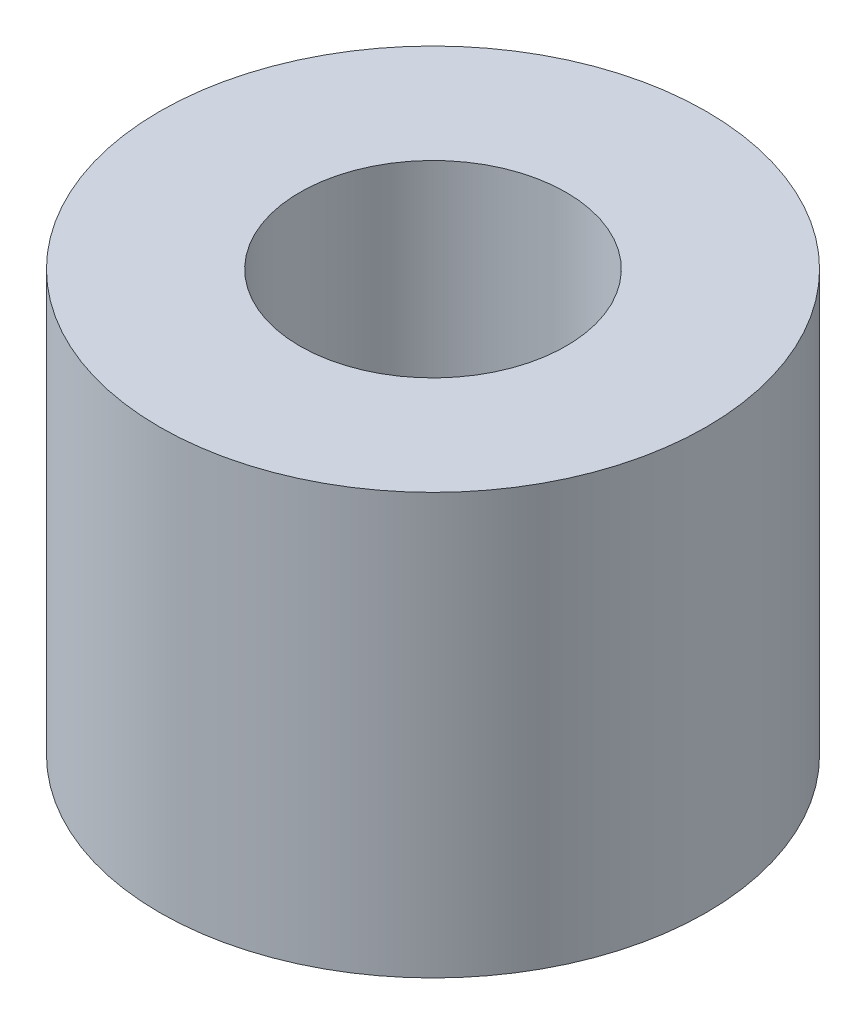
ISO-10303-21;
HEADER;
FILE_DESCRIPTION(('STEP AP214'),'2;1');
FILE_NAME('part.step','',(''),(''),'','','');
FILE_SCHEMA(('AUTOMOTIVE_DESIGN { 1 0 10303 214 1 1 1 1 }'));
ENDSEC;
DATA;
#1=APPLICATION_CONTEXT('core data for automotive mechanical design processes');
#2=APPLICATION_PROTOCOL_DEFINITION('international standard','automotive_design',2000,#1);
#3=PRODUCT_CONTEXT('',#1,'mechanical');
#4=PRODUCT('Part','Part','',(#3));
#5=PRODUCT_RELATED_PRODUCT_CATEGORY('part','',(#4));
#6=PRODUCT_DEFINITION_FORMATION('','',#4);
#7=PRODUCT_DEFINITION_CONTEXT('part definition',#1,'design');
#8=PRODUCT_DEFINITION('design','',#6,#7);
#9=PRODUCT_DEFINITION_SHAPE('','',#8);
#10=(LENGTH_UNIT() NAMED_UNIT(*) SI_UNIT(.MILLI.,.METRE.));
#11=(NAMED_UNIT(*) PLANE_ANGLE_UNIT() SI_UNIT($,.RADIAN.));
#12=(NAMED_UNIT(*) SI_UNIT($,.STERADIAN.) SOLID_ANGLE_UNIT());
#13=UNCERTAINTY_MEASURE_WITH_UNIT(LENGTH_MEASURE(1.E-05),#10,'distance_accuracy_value','');
#14=(GEOMETRIC_REPRESENTATION_CONTEXT(3) GLOBAL_UNCERTAINTY_ASSIGNED_CONTEXT((#13)) GLOBAL_UNIT_ASSIGNED_CONTEXT((#10,
#11,#12)) REPRESENTATION_CONTEXT('',''));
#15=CARTESIAN_POINT('',(0.,0.,0.));
#16=DIRECTION('',(0.,0.,1.));
#17=DIRECTION('',(1.,0.,0.));
#18=AXIS2_PLACEMENT_3D('',#15,#16,#17);
#19=CARTESIAN_POINT('',(0.,3.,0.));
#20=DIRECTION('',(0.,1.,0.));
#21=DIRECTION('',(0.,0.,1.));
#22=AXIS2_PLACEMENT_3D('',#19,#20,#21);
#23=PLANE('',#22);
#24=CARTESIAN_POINT('',(0.,3.,0.));
#25=DIRECTION('',(0.,1.,0.));
#26=DIRECTION('',(0.,0.,1.));
#27=AXIS2_PLACEMENT_3D('',#24,#25,#26);
#28=CIRCLE('',#27,1.95);
#29=CARTESIAN_POINT('',(0.,3.,1.95));
#30=VERTEX_POINT('',#29);
#31=EDGE_CURVE('E10',#30,#30,#28,.T.);
#32=ORIENTED_EDGE('',*,*,#31,.T.);
#33=EDGE_LOOP('',(#32));
#34=FACE_BOUND('',#33,.T.);
#35=CARTESIAN_POINT('',(0.,3.,0.));
#36=DIRECTION('',(0.,1.,0.));
#37=DIRECTION('',(0.,0.,1.));
#38=AXIS2_PLACEMENT_3D('',#35,#36,#37);
#39=CIRCLE('',#38,0.95);
#40=CARTESIAN_POINT('',(0.,3.,0.95));
#41=VERTEX_POINT('',#40);
#42=EDGE_CURVE('E56',#41,#41,#39,.T.);
#43=ORIENTED_EDGE('',*,*,#42,.F.);
#44=EDGE_LOOP('',(#43));
#45=FACE_BOUND('',#44,.T.);
#46=ADVANCED_FACE('F43',(#34,#45),#23,.T.);
#47=CARTESIAN_POINT('',(0.,0.,0.));
#48=DIRECTION('',(0.,1.,0.));
#49=DIRECTION('',(0.,0.,1.));
#50=AXIS2_PLACEMENT_3D('',#47,#48,#49);
#51=PLANE('',#50);
#52=CARTESIAN_POINT('',(0.,0.,0.));
#53=DIRECTION('',(0.,1.,0.));
#54=DIRECTION('',(0.,0.,1.));
#55=AXIS2_PLACEMENT_3D('',#52,#53,#54);
#56=CIRCLE('',#55,1.95);
#57=CARTESIAN_POINT('',(0.,0.,1.95));
#58=VERTEX_POINT('',#57);
#59=EDGE_CURVE('E47',#58,#58,#56,.T.);
#60=ORIENTED_EDGE('',*,*,#59,.F.);
#61=EDGE_LOOP('',(#60));
#62=FACE_BOUND('',#61,.T.);
#63=CARTESIAN_POINT('',(0.,0.,0.));
#64=DIRECTION('',(0.,1.,0.));
#65=DIRECTION('',(0.,0.,1.));
#66=AXIS2_PLACEMENT_3D('',#63,#64,#65);
#67=CIRCLE('',#66,0.95);
#68=CARTESIAN_POINT('',(0.,0.,0.95));
#69=VERTEX_POINT('',#68);
#70=EDGE_CURVE('E58',#69,#69,#67,.T.);
#71=ORIENTED_EDGE('',*,*,#70,.T.);
#72=EDGE_LOOP('',(#71));
#73=FACE_BOUND('',#72,.T.);
#74=ADVANCED_FACE('F70',(#62,#73),#51,.F.);
#75=CARTESIAN_POINT('',(0.,3.,0.));
#76=DIRECTION('',(0.,-1.,0.));
#77=DIRECTION('',(0.,0.,-1.));
#78=AXIS2_PLACEMENT_3D('',#75,#76,#77);
#79=CYLINDRICAL_SURFACE('',#78,1.95);
#80=ORIENTED_EDGE('',*,*,#31,.F.);
#81=EDGE_LOOP('',(#80));
#82=FACE_BOUND('',#81,.T.);
#83=ORIENTED_EDGE('',*,*,#59,.T.);
#84=EDGE_LOOP('',(#83));
#85=FACE_BOUND('',#84,.T.);
#86=ADVANCED_FACE('F45',(#82,#85),#79,.T.);
#87=CARTESIAN_POINT('',(0.,3.,0.));
#88=DIRECTION('',(0.,-1.,0.));
#89=DIRECTION('',(0.,0.,-1.));
#90=AXIS2_PLACEMENT_3D('',#87,#88,#89);
#91=CYLINDRICAL_SURFACE('',#90,0.95);
#92=ORIENTED_EDGE('',*,*,#42,.T.);
#93=EDGE_LOOP('',(#92));
#94=FACE_BOUND('',#93,.T.);
#95=ORIENTED_EDGE('',*,*,#70,.F.);
#96=EDGE_LOOP('',(#95));
#97=FACE_BOUND('',#96,.T.);
#98=ADVANCED_FACE('F66',(#94,#97),#91,.F.);
#99=CLOSED_SHELL('',(#46,#74,#86,#98));
#100=MANIFOLD_SOLID_BREP('B2',#99);
#101=ADVANCED_BREP_SHAPE_REPRESENTATION('',(#18,#100),#14);
#102=SHAPE_DEFINITION_REPRESENTATION(#9,#101);
ENDSEC;
END-ISO-10303-21;
